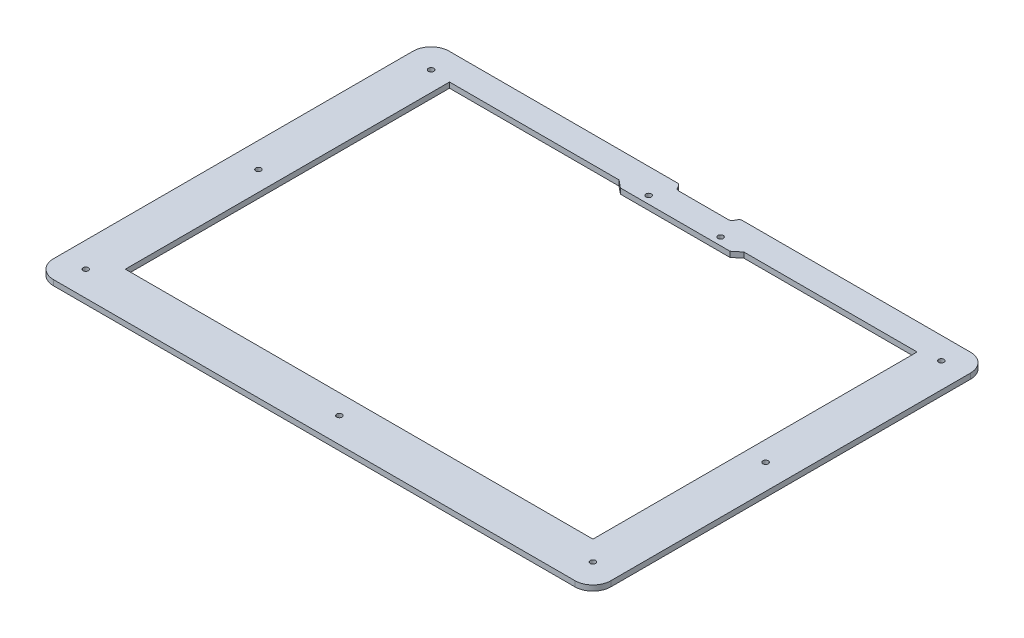
ISO-10303-21;
HEADER;
FILE_DESCRIPTION(('STEP AP214'),'2;1');
FILE_NAME('part.step','',(''),(''),'','','');
FILE_SCHEMA(('AUTOMOTIVE_DESIGN { 1 0 10303 214 1 1 1 1 }'));
ENDSEC;
DATA;
#1=APPLICATION_CONTEXT('core data for automotive mechanical design processes');
#2=APPLICATION_PROTOCOL_DEFINITION('international standard','automotive_design',2000,#1);
#3=PRODUCT_CONTEXT('',#1,'mechanical');
#4=PRODUCT('Part','Part','',(#3));
#5=PRODUCT_RELATED_PRODUCT_CATEGORY('part','',(#4));
#6=PRODUCT_DEFINITION_FORMATION('','',#4);
#7=PRODUCT_DEFINITION_CONTEXT('part definition',#1,'design');
#8=PRODUCT_DEFINITION('design','',#6,#7);
#9=PRODUCT_DEFINITION_SHAPE('','',#8);
#10=(LENGTH_UNIT() NAMED_UNIT(*) SI_UNIT(.MILLI.,.METRE.));
#11=(NAMED_UNIT(*) PLANE_ANGLE_UNIT() SI_UNIT($,.RADIAN.));
#12=(NAMED_UNIT(*) SI_UNIT($,.STERADIAN.) SOLID_ANGLE_UNIT());
#13=UNCERTAINTY_MEASURE_WITH_UNIT(LENGTH_MEASURE(1.E-05),#10,'distance_accuracy_value','');
#14=(GEOMETRIC_REPRESENTATION_CONTEXT(3) GLOBAL_UNCERTAINTY_ASSIGNED_CONTEXT((#13)) GLOBAL_UNIT_ASSIGNED_CONTEXT((#10,
#11,#12)) REPRESENTATION_CONTEXT('',''));
#15=CARTESIAN_POINT('',(0.,0.,0.));
#16=DIRECTION('',(0.,0.,1.));
#17=DIRECTION('',(1.,0.,0.));
#18=AXIS2_PLACEMENT_3D('',#15,#16,#17);
#19=CARTESIAN_POINT('',(10.,3.,10.));
#20=DIRECTION('',(0.,1.,0.));
#21=DIRECTION('',(0.,0.,1.));
#22=AXIS2_PLACEMENT_3D('',#19,#20,#21);
#23=PLANE('',#22);
#24=CARTESIAN_POINT('',(14.,3.,110.));
#25=DIRECTION('',(0.,1.,0.));
#26=DIRECTION('',(0.,0.,1.));
#27=AXIS2_PLACEMENT_3D('',#24,#25,#26);
#28=CIRCLE('',#27,1.49999999999997);
#29=CARTESIAN_POINT('',(14.,3.,111.5));
#30=VERTEX_POINT('',#29);
#31=EDGE_CURVE('E268',#30,#30,#28,.T.);
#32=ORIENTED_EDGE('',*,*,#31,.F.);
#33=EDGE_LOOP('',(#32));
#34=FACE_BOUND('',#33,.T.);
#35=CARTESIAN_POINT('',(155.,3.,206.));
#36=DIRECTION('',(0.,1.,0.));
#37=DIRECTION('',(0.,0.,1.));
#38=AXIS2_PLACEMENT_3D('',#35,#36,#37);
#39=CIRCLE('',#38,1.5);
#40=CARTESIAN_POINT('',(155.,3.,207.5));
#41=VERTEX_POINT('',#40);
#42=EDGE_CURVE('E280',#41,#41,#39,.T.);
#43=ORIENTED_EDGE('',*,*,#42,.F.);
#44=EDGE_LOOP('',(#43));
#45=FACE_BOUND('',#44,.T.);
#46=CARTESIAN_POINT('',(296.,3.,206.));
#47=DIRECTION('',(0.,1.,0.));
#48=DIRECTION('',(0.,0.,1.));
#49=AXIS2_PLACEMENT_3D('',#46,#47,#48);
#50=CIRCLE('',#49,1.49999999999996);
#51=CARTESIAN_POINT('',(296.,3.,207.5));
#52=VERTEX_POINT('',#51);
#53=EDGE_CURVE('E292',#52,#52,#50,.T.);
#54=ORIENTED_EDGE('',*,*,#53,.F.);
#55=EDGE_LOOP('',(#54));
#56=FACE_BOUND('',#55,.T.);
#57=CARTESIAN_POINT('',(14.,3.,14.));
#58=DIRECTION('',(0.,1.,0.));
#59=DIRECTION('',(0.,0.,1.));
#60=AXIS2_PLACEMENT_3D('',#57,#58,#59);
#61=CIRCLE('',#60,1.5);
#62=CARTESIAN_POINT('',(14.,3.,15.5));
#63=VERTEX_POINT('',#62);
#64=EDGE_CURVE('E304',#63,#63,#61,.T.);
#65=ORIENTED_EDGE('',*,*,#64,.F.);
#66=EDGE_LOOP('',(#65));
#67=FACE_BOUND('',#66,.T.);
#68=CARTESIAN_POINT('',(10.,3.,10.));
#69=DIRECTION('',(0.,1.,0.));
#70=DIRECTION('',(0.,0.,1.));
#71=AXIS2_PLACEMENT_3D('',#68,#69,#70);
#72=CIRCLE('',#71,10.);
#73=CARTESIAN_POINT('',(10.,3.,0.));
#74=VERTEX_POINT('',#73);
#75=CARTESIAN_POINT('',(0.,3.,10.));
#76=VERTEX_POINT('',#75);
#77=EDGE_CURVE('E316',#74,#76,#72,.T.);
#78=ORIENTED_EDGE('',*,*,#77,.T.);
#79=DIRECTION('',(0.,0.,1.));
#80=VECTOR('',#79,1.);
#81=CARTESIAN_POINT('',(0.,3.,10.));
#82=LINE('',#81,#80);
#83=CARTESIAN_POINT('',(0.,3.,210.));
#84=VERTEX_POINT('',#83);
#85=EDGE_CURVE('E319',#76,#84,#82,.T.);
#86=ORIENTED_EDGE('',*,*,#85,.T.);
#87=CARTESIAN_POINT('',(10.,3.,210.));
#88=DIRECTION('',(0.,1.,0.));
#89=DIRECTION('',(0.,0.,1.));
#90=AXIS2_PLACEMENT_3D('',#87,#88,#89);
#91=CIRCLE('',#90,10.);
#92=CARTESIAN_POINT('',(10.,3.,220.));
#93=VERTEX_POINT('',#92);
#94=EDGE_CURVE('E322',#84,#93,#91,.T.);
#95=ORIENTED_EDGE('',*,*,#94,.T.);
#96=DIRECTION('',(1.,0.,0.));
#97=VECTOR('',#96,1.);
#98=CARTESIAN_POINT('',(10.,3.,220.));
#99=LINE('',#98,#97);
#100=CARTESIAN_POINT('',(300.,3.,220.));
#101=VERTEX_POINT('',#100);
#102=EDGE_CURVE('E324',#93,#101,#99,.T.);
#103=ORIENTED_EDGE('',*,*,#102,.T.);
#104=CARTESIAN_POINT('',(300.,3.,210.));
#105=DIRECTION('',(0.,1.,0.));
#106=DIRECTION('',(0.,0.,1.));
#107=AXIS2_PLACEMENT_3D('',#104,#105,#106);
#108=CIRCLE('',#107,9.99999999999999);
#109=CARTESIAN_POINT('',(310.,3.,210.));
#110=VERTEX_POINT('',#109);
#111=EDGE_CURVE('E326',#101,#110,#108,.T.);
#112=ORIENTED_EDGE('',*,*,#111,.T.);
#113=DIRECTION('',(0.,0.,-1.));
#114=VECTOR('',#113,1.);
#115=CARTESIAN_POINT('',(310.,3.,10.));
#116=LINE('',#115,#114);
#117=CARTESIAN_POINT('',(310.,3.,10.));
#118=VERTEX_POINT('',#117);
#119=EDGE_CURVE('E328',#110,#118,#116,.T.);
#120=ORIENTED_EDGE('',*,*,#119,.T.);
#121=CARTESIAN_POINT('',(300.,3.,10.));
#122=DIRECTION('',(0.,1.,0.));
#123=DIRECTION('',(0.,0.,-1.));
#124=AXIS2_PLACEMENT_3D('',#121,#122,#123);
#125=CIRCLE('',#124,9.99999999999998);
#126=CARTESIAN_POINT('',(300.,3.,0.));
#127=VERTEX_POINT('',#126);
#128=EDGE_CURVE('E330',#118,#127,#125,.T.);
#129=ORIENTED_EDGE('',*,*,#128,.T.);
#130=DIRECTION('',(-1.,0.,0.));
#131=VECTOR('',#130,1.);
#132=CARTESIAN_POINT('',(173.115639288473,3.,0.));
#133=LINE('',#132,#131);
#134=CARTESIAN_POINT('',(173.115639288473,3.,0.));
#135=VERTEX_POINT('',#134);
#136=EDGE_CURVE('E332',#127,#135,#133,.T.);
#137=ORIENTED_EDGE('',*,*,#136,.T.);
#138=CARTESIAN_POINT('',(173.115639288473,3.,2.));
#139=DIRECTION('',(0.,1.,0.));
#140=DIRECTION('',(0.,0.,1.));
#141=AXIS2_PLACEMENT_3D('',#138,#139,#140);
#142=CIRCLE('',#141,2.00000000000001);
#143=CARTESIAN_POINT('',(171.365639288473,3.,1.03175416344815));
#144=VERTEX_POINT('',#143);
#145=EDGE_CURVE('E334',#135,#144,#142,.T.);
#146=ORIENTED_EDGE('',*,*,#145,.T.);
#147=DIRECTION('',(-0.484122918275928,0.,0.874999999999999));
#148=VECTOR('',#147,1.);
#149=CARTESIAN_POINT('',(170.570852384631,3.,2.46824583655185));
#150=LINE('',#149,#148);
#151=CARTESIAN_POINT('',(170.570852384631,3.,2.46824583655186));
#152=VERTEX_POINT('',#151);
#153=EDGE_CURVE('E336',#144,#152,#150,.T.);
#154=ORIENTED_EDGE('',*,*,#153,.T.);
#155=CARTESIAN_POINT('',(168.820852384631,3.,1.5));
#156=DIRECTION('',(0.,-1.,0.));
#157=DIRECTION('',(0.,0.,-1.));
#158=AXIS2_PLACEMENT_3D('',#155,#156,#157);
#159=CIRCLE('',#158,1.99999999999999);
#160=CARTESIAN_POINT('',(168.820852384631,3.,3.5));
#161=VERTEX_POINT('',#160);
#162=EDGE_CURVE('E338',#152,#161,#159,.T.);
#163=ORIENTED_EDGE('',*,*,#162,.T.);
#164=DIRECTION('',(-1.,0.,0.));
#165=VECTOR('',#164,1.);
#166=CARTESIAN_POINT('',(141.179147615369,3.,3.5));
#167=LINE('',#166,#165);
#168=CARTESIAN_POINT('',(141.179147615369,3.,3.50000000000002));
#169=VERTEX_POINT('',#168);
#170=EDGE_CURVE('E340',#161,#169,#167,.T.);
#171=ORIENTED_EDGE('',*,*,#170,.T.);
#172=CARTESIAN_POINT('',(141.179147615369,3.,1.5));
#173=DIRECTION('',(0.,-1.,0.));
#174=DIRECTION('',(0.,0.,-1.));
#175=AXIS2_PLACEMENT_3D('',#172,#173,#174);
#176=CIRCLE('',#175,2.00000000000002);
#177=CARTESIAN_POINT('',(139.429147615369,3.,2.46824583655182));
#178=VERTEX_POINT('',#177);
#179=EDGE_CURVE('E342',#169,#178,#176,.T.);
#180=ORIENTED_EDGE('',*,*,#179,.T.);
#181=DIRECTION('',(-0.484122918275918,0.,-0.875000000000005));
#182=VECTOR('',#181,1.);
#183=CARTESIAN_POINT('',(139.429147615369,3.,2.46824583655182));
#184=LINE('',#183,#182);
#185=CARTESIAN_POINT('',(138.634360711527,3.,1.03175416344817));
#186=VERTEX_POINT('',#185);
#187=EDGE_CURVE('E344',#178,#186,#184,.T.);
#188=ORIENTED_EDGE('',*,*,#187,.T.);
#189=CARTESIAN_POINT('',(136.884360711527,3.,2.));
#190=DIRECTION('',(0.,1.,0.));
#191=DIRECTION('',(0.,0.,-1.));
#192=AXIS2_PLACEMENT_3D('',#189,#190,#191);
#193=CIRCLE('',#192,1.99999999999999);
#194=CARTESIAN_POINT('',(136.884360711527,3.,0.));
#195=VERTEX_POINT('',#194);
#196=EDGE_CURVE('E346',#186,#195,#193,.T.);
#197=ORIENTED_EDGE('',*,*,#196,.T.);
#198=DIRECTION('',(-1.,0.,0.));
#199=VECTOR('',#198,1.);
#200=CARTESIAN_POINT('',(10.,3.,0.));
#201=LINE('',#200,#199);
#202=EDGE_CURVE('E348',#195,#74,#201,.T.);
#203=ORIENTED_EDGE('',*,*,#202,.T.);
#204=EDGE_LOOP('',(#78,#86,#95,#103,#112,#120,#129,#137,#146,#154,#163,#171,#180,#188,#197,#203));
#205=FACE_BOUND('',#204,.T.);
#206=CARTESIAN_POINT('',(296.,3.,110.));
#207=DIRECTION('',(0.,1.,0.));
#208=DIRECTION('',(0.,0.,1.));
#209=AXIS2_PLACEMENT_3D('',#206,#207,#208);
#210=CIRCLE('',#209,1.49999999999997);
#211=CARTESIAN_POINT('',(296.,3.,111.5));
#212=VERTEX_POINT('',#211);
#213=EDGE_CURVE('E310',#212,#212,#210,.T.);
#214=ORIENTED_EDGE('',*,*,#213,.F.);
#215=EDGE_LOOP('',(#214));
#216=FACE_BOUND('',#215,.T.);
#217=CARTESIAN_POINT('',(14.,3.,206.));
#218=DIRECTION('',(0.,1.,0.));
#219=DIRECTION('',(0.,0.,1.));
#220=AXIS2_PLACEMENT_3D('',#217,#218,#219);
#221=CIRCLE('',#220,1.5);
#222=CARTESIAN_POINT('',(14.,3.,207.5));
#223=VERTEX_POINT('',#222);
#224=EDGE_CURVE('E298',#223,#223,#221,.T.);
#225=ORIENTED_EDGE('',*,*,#224,.F.);
#226=EDGE_LOOP('',(#225));
#227=FACE_BOUND('',#226,.T.);
#228=CARTESIAN_POINT('',(296.,3.,12.2856825395512));
#229=DIRECTION('',(0.,1.,0.));
#230=DIRECTION('',(0.,0.,1.));
#231=AXIS2_PLACEMENT_3D('',#228,#229,#230);
#232=CIRCLE('',#231,1.49999999999997);
#233=CARTESIAN_POINT('',(296.,3.,13.7856825395512));
#234=VERTEX_POINT('',#233);
#235=EDGE_CURVE('E286',#234,#234,#232,.T.);
#236=ORIENTED_EDGE('',*,*,#235,.F.);
#237=EDGE_LOOP('',(#236));
#238=FACE_BOUND('',#237,.T.);
#239=CARTESIAN_POINT('',(175.,3.,14.));
#240=DIRECTION('',(0.,1.,0.));
#241=DIRECTION('',(0.,0.,1.));
#242=AXIS2_PLACEMENT_3D('',#239,#240,#241);
#243=CIRCLE('',#242,1.49999999999997);
#244=CARTESIAN_POINT('',(175.,3.,15.5));
#245=VERTEX_POINT('',#244);
#246=EDGE_CURVE('E274',#245,#245,#243,.T.);
#247=ORIENTED_EDGE('',*,*,#246,.F.);
#248=EDGE_LOOP('',(#247));
#249=FACE_BOUND('',#248,.T.);
#250=CARTESIAN_POINT('',(135.,3.,14.));
#251=DIRECTION('',(0.,1.,0.));
#252=DIRECTION('',(0.,0.,1.));
#253=AXIS2_PLACEMENT_3D('',#250,#251,#252);
#254=CIRCLE('',#253,1.49999999999997);
#255=CARTESIAN_POINT('',(135.,3.,15.5));
#256=VERTEX_POINT('',#255);
#257=EDGE_CURVE('E262',#256,#256,#254,.T.);
#258=ORIENTED_EDGE('',*,*,#257,.F.);
#259=EDGE_LOOP('',(#258));
#260=FACE_BOUND('',#259,.T.);
#261=DIRECTION('',(-1.,0.,0.));
#262=VECTOR('',#261,1.);
#263=CARTESIAN_POINT('',(119.25,3.,14.75));
#264=LINE('',#263,#262);
#265=CARTESIAN_POINT('',(119.25,3.,14.75));
#266=VERTEX_POINT('',#265);
#267=CARTESIAN_POINT('',(25.,3.,14.7500000000004));
#268=VERTEX_POINT('',#267);
#269=EDGE_CURVE('E205',#266,#268,#264,.T.);
#270=ORIENTED_EDGE('',*,*,#269,.F.);
#271=DIRECTION('',(-0.77518690013775,0.,-0.631731960450654));
#272=VECTOR('',#271,1.);
#273=CARTESIAN_POINT('',(123.544786903842,3.,18.25));
#274=LINE('',#273,#272);
#275=CARTESIAN_POINT('',(123.544786903842,3.,18.25));
#276=VERTEX_POINT('',#275);
#277=EDGE_CURVE('E197',#276,#266,#274,.T.);
#278=ORIENTED_EDGE('',*,*,#277,.F.);
#279=DIRECTION('',(-1.,0.,0.));
#280=VECTOR('',#279,1.);
#281=CARTESIAN_POINT('',(184.455213096158,3.,18.25));
#282=LINE('',#281,#280);
#283=CARTESIAN_POINT('',(184.455213096158,3.,18.25));
#284=VERTEX_POINT('',#283);
#285=EDGE_CURVE('E230',#284,#276,#282,.T.);
#286=ORIENTED_EDGE('',*,*,#285,.F.);
#287=DIRECTION('',(-0.775186900137753,0.,0.63173196045065));
#288=VECTOR('',#287,1.);
#289=CARTESIAN_POINT('',(184.455213096158,3.,18.25));
#290=LINE('',#289,#288);
#291=CARTESIAN_POINT('',(188.75,3.,14.75));
#292=VERTEX_POINT('',#291);
#293=EDGE_CURVE('E228',#292,#284,#290,.T.);
#294=ORIENTED_EDGE('',*,*,#293,.F.);
#295=DIRECTION('',(-1.,0.,0.));
#296=VECTOR('',#295,1.);
#297=CARTESIAN_POINT('',(188.75,3.,14.75));
#298=LINE('',#297,#296);
#299=CARTESIAN_POINT('',(285.,3.,14.75));
#300=VERTEX_POINT('',#299);
#301=EDGE_CURVE('E226',#300,#292,#298,.T.);
#302=ORIENTED_EDGE('',*,*,#301,.F.);
#303=DIRECTION('',(0.,0.,-1.));
#304=VECTOR('',#303,1.);
#305=CARTESIAN_POINT('',(285.,3.,195.));
#306=LINE('',#305,#304);
#307=CARTESIAN_POINT('',(285.,3.,195.));
#308=VERTEX_POINT('',#307);
#309=EDGE_CURVE('E224',#308,#300,#306,.T.);
#310=ORIENTED_EDGE('',*,*,#309,.F.);
#311=DIRECTION('',(1.,0.,0.));
#312=VECTOR('',#311,1.);
#313=CARTESIAN_POINT('',(25.,3.,195.));
#314=LINE('',#313,#312);
#315=CARTESIAN_POINT('',(25.,3.,195.));
#316=VERTEX_POINT('',#315);
#317=EDGE_CURVE('E220',#316,#308,#314,.T.);
#318=ORIENTED_EDGE('',*,*,#317,.F.);
#319=DIRECTION('',(0.,0.,1.));
#320=VECTOR('',#319,1.);
#321=CARTESIAN_POINT('',(25.,3.,14.7500000000004));
#322=LINE('',#321,#320);
#323=EDGE_CURVE('E218',#268,#316,#322,.T.);
#324=ORIENTED_EDGE('',*,*,#323,.F.);
#325=EDGE_LOOP('',(#270,#278,#286,#294,#302,#310,#318,#324));
#326=FACE_BOUND('',#325,.T.);
#327=ADVANCED_FACE('F36',(#34,#45,#56,#67,#205,#216,#227,#238,#249,#260,#326),#23,.T.);
#328=CARTESIAN_POINT('',(10.,0.,10.));
#329=DIRECTION('',(0.,1.,0.));
#330=DIRECTION('',(0.,0.,1.));
#331=AXIS2_PLACEMENT_3D('',#328,#329,#330);
#332=PLANE('',#331);
#333=CARTESIAN_POINT('',(135.,0.,14.));
#334=DIRECTION('',(0.,1.,0.));
#335=DIRECTION('',(0.,0.,1.));
#336=AXIS2_PLACEMENT_3D('',#333,#334,#335);
#337=CIRCLE('',#336,1.49999999999997);
#338=CARTESIAN_POINT('',(135.,0.,15.5));
#339=VERTEX_POINT('',#338);
#340=EDGE_CURVE('E213',#339,#339,#337,.T.);
#341=ORIENTED_EDGE('',*,*,#340,.T.);
#342=EDGE_LOOP('',(#341));
#343=FACE_BOUND('',#342,.T.);
#344=CARTESIAN_POINT('',(14.,0.,110.));
#345=DIRECTION('',(0.,1.,0.));
#346=DIRECTION('',(0.,0.,1.));
#347=AXIS2_PLACEMENT_3D('',#344,#345,#346);
#348=CIRCLE('',#347,1.49999999999997);
#349=CARTESIAN_POINT('',(14.,0.,111.5));
#350=VERTEX_POINT('',#349);
#351=EDGE_CURVE('E265',#350,#350,#348,.T.);
#352=ORIENTED_EDGE('',*,*,#351,.T.);
#353=EDGE_LOOP('',(#352));
#354=FACE_BOUND('',#353,.T.);
#355=CARTESIAN_POINT('',(175.,0.,14.));
#356=DIRECTION('',(0.,1.,0.));
#357=DIRECTION('',(0.,0.,1.));
#358=AXIS2_PLACEMENT_3D('',#355,#356,#357);
#359=CIRCLE('',#358,1.49999999999997);
#360=CARTESIAN_POINT('',(175.,0.,15.5));
#361=VERTEX_POINT('',#360);
#362=EDGE_CURVE('E271',#361,#361,#359,.T.);
#363=ORIENTED_EDGE('',*,*,#362,.T.);
#364=EDGE_LOOP('',(#363));
#365=FACE_BOUND('',#364,.T.);
#366=CARTESIAN_POINT('',(155.,0.,206.));
#367=DIRECTION('',(0.,1.,0.));
#368=DIRECTION('',(0.,0.,1.));
#369=AXIS2_PLACEMENT_3D('',#366,#367,#368);
#370=CIRCLE('',#369,1.5);
#371=CARTESIAN_POINT('',(155.,0.,207.5));
#372=VERTEX_POINT('',#371);
#373=EDGE_CURVE('E277',#372,#372,#370,.T.);
#374=ORIENTED_EDGE('',*,*,#373,.T.);
#375=EDGE_LOOP('',(#374));
#376=FACE_BOUND('',#375,.T.);
#377=CARTESIAN_POINT('',(296.,0.,12.2856825395512));
#378=DIRECTION('',(0.,1.,0.));
#379=DIRECTION('',(0.,0.,1.));
#380=AXIS2_PLACEMENT_3D('',#377,#378,#379);
#381=CIRCLE('',#380,1.49999999999997);
#382=CARTESIAN_POINT('',(296.,0.,13.7856825395512));
#383=VERTEX_POINT('',#382);
#384=EDGE_CURVE('E283',#383,#383,#381,.T.);
#385=ORIENTED_EDGE('',*,*,#384,.T.);
#386=EDGE_LOOP('',(#385));
#387=FACE_BOUND('',#386,.T.);
#388=CARTESIAN_POINT('',(296.,0.,206.));
#389=DIRECTION('',(0.,1.,0.));
#390=DIRECTION('',(0.,0.,1.));
#391=AXIS2_PLACEMENT_3D('',#388,#389,#390);
#392=CIRCLE('',#391,1.49999999999996);
#393=CARTESIAN_POINT('',(296.,0.,207.5));
#394=VERTEX_POINT('',#393);
#395=EDGE_CURVE('E289',#394,#394,#392,.T.);
#396=ORIENTED_EDGE('',*,*,#395,.T.);
#397=EDGE_LOOP('',(#396));
#398=FACE_BOUND('',#397,.T.);
#399=CARTESIAN_POINT('',(14.,0.,206.));
#400=DIRECTION('',(0.,1.,0.));
#401=DIRECTION('',(0.,0.,1.));
#402=AXIS2_PLACEMENT_3D('',#399,#400,#401);
#403=CIRCLE('',#402,1.5);
#404=CARTESIAN_POINT('',(14.,0.,207.5));
#405=VERTEX_POINT('',#404);
#406=EDGE_CURVE('E295',#405,#405,#403,.T.);
#407=ORIENTED_EDGE('',*,*,#406,.T.);
#408=EDGE_LOOP('',(#407));
#409=FACE_BOUND('',#408,.T.);
#410=CARTESIAN_POINT('',(14.,0.,14.));
#411=DIRECTION('',(0.,1.,0.));
#412=DIRECTION('',(0.,0.,1.));
#413=AXIS2_PLACEMENT_3D('',#410,#411,#412);
#414=CIRCLE('',#413,1.5);
#415=CARTESIAN_POINT('',(14.,0.,15.5));
#416=VERTEX_POINT('',#415);
#417=EDGE_CURVE('E301',#416,#416,#414,.T.);
#418=ORIENTED_EDGE('',*,*,#417,.T.);
#419=EDGE_LOOP('',(#418));
#420=FACE_BOUND('',#419,.T.);
#421=CARTESIAN_POINT('',(296.,0.,110.));
#422=DIRECTION('',(0.,1.,0.));
#423=DIRECTION('',(0.,0.,1.));
#424=AXIS2_PLACEMENT_3D('',#421,#422,#423);
#425=CIRCLE('',#424,1.49999999999997);
#426=CARTESIAN_POINT('',(296.,0.,111.5));
#427=VERTEX_POINT('',#426);
#428=EDGE_CURVE('E307',#427,#427,#425,.T.);
#429=ORIENTED_EDGE('',*,*,#428,.T.);
#430=EDGE_LOOP('',(#429));
#431=FACE_BOUND('',#430,.T.);
#432=CARTESIAN_POINT('',(10.,0.,10.));
#433=DIRECTION('',(0.,1.,0.));
#434=DIRECTION('',(0.,0.,1.));
#435=AXIS2_PLACEMENT_3D('',#432,#433,#434);
#436=CIRCLE('',#435,10.);
#437=CARTESIAN_POINT('',(10.,0.,0.));
#438=VERTEX_POINT('',#437);
#439=CARTESIAN_POINT('',(0.,0.,10.));
#440=VERTEX_POINT('',#439);
#441=EDGE_CURVE('E313',#438,#440,#436,.T.);
#442=ORIENTED_EDGE('',*,*,#441,.F.);
#443=DIRECTION('',(-1.,0.,0.));
#444=VECTOR('',#443,1.);
#445=CARTESIAN_POINT('',(10.,0.,0.));
#446=LINE('',#445,#444);
#447=CARTESIAN_POINT('',(136.884360711527,0.,0.));
#448=VERTEX_POINT('',#447);
#449=EDGE_CURVE('E320',#448,#438,#446,.T.);
#450=ORIENTED_EDGE('',*,*,#449,.F.);
#451=CARTESIAN_POINT('',(136.884360711527,0.,2.));
#452=DIRECTION('',(0.,1.,0.));
#453=DIRECTION('',(0.,0.,-1.));
#454=AXIS2_PLACEMENT_3D('',#451,#452,#453);
#455=CIRCLE('',#454,1.99999999999999);
#456=CARTESIAN_POINT('',(138.634360711527,0.,1.03175416344817));
#457=VERTEX_POINT('',#456);
#458=EDGE_CURVE('E379',#457,#448,#455,.T.);
#459=ORIENTED_EDGE('',*,*,#458,.F.);
#460=DIRECTION('',(-0.484122918275918,0.,-0.875000000000005));
#461=VECTOR('',#460,1.);
#462=CARTESIAN_POINT('',(139.429147615369,0.,2.46824583655182));
#463=LINE('',#462,#461);
#464=CARTESIAN_POINT('',(139.429147615369,0.,2.46824583655182));
#465=VERTEX_POINT('',#464);
#466=EDGE_CURVE('E377',#465,#457,#463,.T.);
#467=ORIENTED_EDGE('',*,*,#466,.F.);
#468=CARTESIAN_POINT('',(141.179147615369,0.,1.5));
#469=DIRECTION('',(0.,-1.,0.));
#470=DIRECTION('',(0.,0.,-1.));
#471=AXIS2_PLACEMENT_3D('',#468,#469,#470);
#472=CIRCLE('',#471,2.00000000000002);
#473=CARTESIAN_POINT('',(141.179147615369,0.,3.50000000000002));
#474=VERTEX_POINT('',#473);
#475=EDGE_CURVE('E375',#474,#465,#472,.T.);
#476=ORIENTED_EDGE('',*,*,#475,.F.);
#477=DIRECTION('',(-1.,0.,0.));
#478=VECTOR('',#477,1.);
#479=CARTESIAN_POINT('',(141.179147615369,0.,3.5));
#480=LINE('',#479,#478);
#481=CARTESIAN_POINT('',(168.820852384631,0.,3.5));
#482=VERTEX_POINT('',#481);
#483=EDGE_CURVE('E373',#482,#474,#480,.T.);
#484=ORIENTED_EDGE('',*,*,#483,.F.);
#485=CARTESIAN_POINT('',(168.820852384631,0.,1.5));
#486=DIRECTION('',(0.,-1.,0.));
#487=DIRECTION('',(0.,0.,-1.));
#488=AXIS2_PLACEMENT_3D('',#485,#486,#487);
#489=CIRCLE('',#488,1.99999999999999);
#490=CARTESIAN_POINT('',(170.570852384631,0.,2.46824583655186));
#491=VERTEX_POINT('',#490);
#492=EDGE_CURVE('E371',#491,#482,#489,.T.);
#493=ORIENTED_EDGE('',*,*,#492,.F.);
#494=DIRECTION('',(-0.484122918275928,0.,0.874999999999999));
#495=VECTOR('',#494,1.);
#496=CARTESIAN_POINT('',(170.570852384631,0.,2.46824583655185));
#497=LINE('',#496,#495);
#498=CARTESIAN_POINT('',(171.365639288473,0.,1.03175416344815));
#499=VERTEX_POINT('',#498);
#500=EDGE_CURVE('E369',#499,#491,#497,.T.);
#501=ORIENTED_EDGE('',*,*,#500,.F.);
#502=CARTESIAN_POINT('',(173.115639288473,0.,2.));
#503=DIRECTION('',(0.,1.,0.));
#504=DIRECTION('',(0.,0.,1.));
#505=AXIS2_PLACEMENT_3D('',#502,#503,#504);
#506=CIRCLE('',#505,2.00000000000001);
#507=CARTESIAN_POINT('',(173.115639288473,0.,0.));
#508=VERTEX_POINT('',#507);
#509=EDGE_CURVE('E367',#508,#499,#506,.T.);
#510=ORIENTED_EDGE('',*,*,#509,.F.);
#511=DIRECTION('',(-1.,0.,0.));
#512=VECTOR('',#511,1.);
#513=CARTESIAN_POINT('',(173.115639288473,0.,0.));
#514=LINE('',#513,#512);
#515=CARTESIAN_POINT('',(300.,0.,0.));
#516=VERTEX_POINT('',#515);
#517=EDGE_CURVE('E365',#516,#508,#514,.T.);
#518=ORIENTED_EDGE('',*,*,#517,.F.);
#519=CARTESIAN_POINT('',(300.,0.,10.));
#520=DIRECTION('',(0.,1.,0.));
#521=DIRECTION('',(0.,0.,-1.));
#522=AXIS2_PLACEMENT_3D('',#519,#520,#521);
#523=CIRCLE('',#522,9.99999999999998);
#524=CARTESIAN_POINT('',(310.,0.,10.));
#525=VERTEX_POINT('',#524);
#526=EDGE_CURVE('E363',#525,#516,#523,.T.);
#527=ORIENTED_EDGE('',*,*,#526,.F.);
#528=DIRECTION('',(0.,0.,-1.));
#529=VECTOR('',#528,1.);
#530=CARTESIAN_POINT('',(310.,0.,10.));
#531=LINE('',#530,#529);
#532=CARTESIAN_POINT('',(310.,0.,210.));
#533=VERTEX_POINT('',#532);
#534=EDGE_CURVE('E361',#533,#525,#531,.T.);
#535=ORIENTED_EDGE('',*,*,#534,.F.);
#536=CARTESIAN_POINT('',(300.,0.,210.));
#537=DIRECTION('',(0.,1.,0.));
#538=DIRECTION('',(0.,0.,1.));
#539=AXIS2_PLACEMENT_3D('',#536,#537,#538);
#540=CIRCLE('',#539,9.99999999999999);
#541=CARTESIAN_POINT('',(300.,0.,220.));
#542=VERTEX_POINT('',#541);
#543=EDGE_CURVE('E359',#542,#533,#540,.T.);
#544=ORIENTED_EDGE('',*,*,#543,.F.);
#545=DIRECTION('',(1.,0.,0.));
#546=VECTOR('',#545,1.);
#547=CARTESIAN_POINT('',(10.,0.,220.));
#548=LINE('',#547,#546);
#549=CARTESIAN_POINT('',(10.,0.,220.));
#550=VERTEX_POINT('',#549);
#551=EDGE_CURVE('E357',#550,#542,#548,.T.);
#552=ORIENTED_EDGE('',*,*,#551,.F.);
#553=CARTESIAN_POINT('',(10.,0.,210.));
#554=DIRECTION('',(0.,1.,0.));
#555=DIRECTION('',(0.,0.,1.));
#556=AXIS2_PLACEMENT_3D('',#553,#554,#555);
#557=CIRCLE('',#556,10.);
#558=CARTESIAN_POINT('',(0.,0.,210.));
#559=VERTEX_POINT('',#558);
#560=EDGE_CURVE('E355',#559,#550,#557,.T.);
#561=ORIENTED_EDGE('',*,*,#560,.F.);
#562=DIRECTION('',(0.,0.,1.));
#563=VECTOR('',#562,1.);
#564=CARTESIAN_POINT('',(0.,0.,10.));
#565=LINE('',#564,#563);
#566=EDGE_CURVE('E353',#440,#559,#565,.T.);
#567=ORIENTED_EDGE('',*,*,#566,.F.);
#568=EDGE_LOOP('',(#442,#450,#459,#467,#476,#484,#493,#501,#510,#518,#527,#535,#544,#552,#561,#567));
#569=FACE_BOUND('',#568,.T.);
#570=DIRECTION('',(-0.77518690013775,0.,-0.631731960450654));
#571=VECTOR('',#570,1.);
#572=CARTESIAN_POINT('',(123.544786903842,0.,18.25));
#573=LINE('',#572,#571);
#574=CARTESIAN_POINT('',(123.544786903842,0.,18.25));
#575=VERTEX_POINT('',#574);
#576=CARTESIAN_POINT('',(119.25,0.,14.75));
#577=VERTEX_POINT('',#576);
#578=EDGE_CURVE('E59',#575,#577,#573,.T.);
#579=ORIENTED_EDGE('',*,*,#578,.T.);
#580=DIRECTION('',(-1.,0.,0.));
#581=VECTOR('',#580,1.);
#582=CARTESIAN_POINT('',(119.25,0.,14.75));
#583=LINE('',#582,#581);
#584=CARTESIAN_POINT('',(25.,0.,14.7500000000004));
#585=VERTEX_POINT('',#584);
#586=EDGE_CURVE('E212',#577,#585,#583,.T.);
#587=ORIENTED_EDGE('',*,*,#586,.T.);
#588=DIRECTION('',(0.,0.,1.));
#589=VECTOR('',#588,1.);
#590=CARTESIAN_POINT('',(25.,0.,14.7500000000004));
#591=LINE('',#590,#589);
#592=CARTESIAN_POINT('',(25.,0.,195.));
#593=VERTEX_POINT('',#592);
#594=EDGE_CURVE('E234',#585,#593,#591,.T.);
#595=ORIENTED_EDGE('',*,*,#594,.T.);
#596=DIRECTION('',(1.,0.,0.));
#597=VECTOR('',#596,1.);
#598=CARTESIAN_POINT('',(25.,0.,195.));
#599=LINE('',#598,#597);
#600=CARTESIAN_POINT('',(285.,0.,195.));
#601=VERTEX_POINT('',#600);
#602=EDGE_CURVE('E237',#593,#601,#599,.T.);
#603=ORIENTED_EDGE('',*,*,#602,.T.);
#604=DIRECTION('',(0.,0.,-1.));
#605=VECTOR('',#604,1.);
#606=CARTESIAN_POINT('',(285.,0.,195.));
#607=LINE('',#606,#605);
#608=CARTESIAN_POINT('',(285.,0.,14.75));
#609=VERTEX_POINT('',#608);
#610=EDGE_CURVE('E240',#601,#609,#607,.T.);
#611=ORIENTED_EDGE('',*,*,#610,.T.);
#612=DIRECTION('',(-1.,0.,0.));
#613=VECTOR('',#612,1.);
#614=CARTESIAN_POINT('',(188.75,0.,14.75));
#615=LINE('',#614,#613);
#616=CARTESIAN_POINT('',(188.75,0.,14.75));
#617=VERTEX_POINT('',#616);
#618=EDGE_CURVE('E243',#609,#617,#615,.T.);
#619=ORIENTED_EDGE('',*,*,#618,.T.);
#620=DIRECTION('',(-0.775186900137753,0.,0.63173196045065));
#621=VECTOR('',#620,1.);
#622=CARTESIAN_POINT('',(184.455213096158,0.,18.25));
#623=LINE('',#622,#621);
#624=CARTESIAN_POINT('',(184.455213096158,0.,18.25));
#625=VERTEX_POINT('',#624);
#626=EDGE_CURVE('E246',#617,#625,#623,.T.);
#627=ORIENTED_EDGE('',*,*,#626,.T.);
#628=DIRECTION('',(-1.,0.,0.));
#629=VECTOR('',#628,1.);
#630=CARTESIAN_POINT('',(123.544786903842,0.,18.25));
#631=LINE('',#630,#629);
#632=EDGE_CURVE('E206',#625,#575,#631,.T.);
#633=ORIENTED_EDGE('',*,*,#632,.T.);
#634=EDGE_LOOP('',(#579,#587,#595,#603,#611,#619,#627,#633));
#635=FACE_BOUND('',#634,.T.);
#636=ADVANCED_FACE('F433',(#343,#354,#365,#376,#387,#398,#409,#420,#431,#569,#635),#332,.F.);
#637=CARTESIAN_POINT('',(10.,3.,10.));
#638=DIRECTION('',(0.,-1.,0.));
#639=DIRECTION('',(0.,0.,-1.));
#640=AXIS2_PLACEMENT_3D('',#637,#638,#639);
#641=CYLINDRICAL_SURFACE('',#640,10.);
#642=ORIENTED_EDGE('',*,*,#441,.T.);
#643=DIRECTION('',(0.,-1.,0.));
#644=VECTOR('',#643,1.);
#645=CARTESIAN_POINT('',(0.,3.,10.));
#646=LINE('',#645,#644);
#647=EDGE_CURVE('E11',#76,#440,#646,.T.);
#648=ORIENTED_EDGE('',*,*,#647,.F.);
#649=ORIENTED_EDGE('',*,*,#77,.F.);
#650=DIRECTION('',(0.,-1.,0.));
#651=VECTOR('',#650,1.);
#652=CARTESIAN_POINT('',(10.,3.,0.));
#653=LINE('',#652,#651);
#654=EDGE_CURVE('E350',#74,#438,#653,.T.);
#655=ORIENTED_EDGE('',*,*,#654,.T.);
#656=EDGE_LOOP('',(#642,#648,#649,#655));
#657=FACE_BOUND('',#656,.T.);
#658=ADVANCED_FACE('F38',(#657),#641,.T.);
#659=CARTESIAN_POINT('',(0.,3.,10.));
#660=DIRECTION('',(1.,0.,0.));
#661=DIRECTION('',(0.,0.,-1.));
#662=AXIS2_PLACEMENT_3D('',#659,#660,#661);
#663=PLANE('',#662);
#664=ORIENTED_EDGE('',*,*,#566,.T.);
#665=DIRECTION('',(0.,-1.,0.));
#666=VECTOR('',#665,1.);
#667=CARTESIAN_POINT('',(0.,3.,210.));
#668=LINE('',#667,#666);
#669=EDGE_CURVE('E44',#84,#559,#668,.T.);
#670=ORIENTED_EDGE('',*,*,#669,.F.);
#671=ORIENTED_EDGE('',*,*,#85,.F.);
#672=ORIENTED_EDGE('',*,*,#647,.T.);
#673=EDGE_LOOP('',(#664,#670,#671,#672));
#674=FACE_BOUND('',#673,.T.);
#675=ADVANCED_FACE('F451',(#674),#663,.F.);
#676=CARTESIAN_POINT('',(10.,3.,210.));
#677=DIRECTION('',(0.,-1.,0.));
#678=DIRECTION('',(0.,0.,-1.));
#679=AXIS2_PLACEMENT_3D('',#676,#677,#678);
#680=CYLINDRICAL_SURFACE('',#679,10.);
#681=ORIENTED_EDGE('',*,*,#560,.T.);
#682=DIRECTION('',(0.,-1.,0.));
#683=VECTOR('',#682,1.);
#684=CARTESIAN_POINT('',(10.,3.,220.));
#685=LINE('',#684,#683);
#686=EDGE_CURVE('E420',#93,#550,#685,.T.);
#687=ORIENTED_EDGE('',*,*,#686,.F.);
#688=ORIENTED_EDGE('',*,*,#94,.F.);
#689=ORIENTED_EDGE('',*,*,#669,.T.);
#690=EDGE_LOOP('',(#681,#687,#688,#689));
#691=FACE_BOUND('',#690,.T.);
#692=ADVANCED_FACE('F427',(#691),#680,.T.);
#693=CARTESIAN_POINT('',(10.,3.,220.));
#694=DIRECTION('',(0.,0.,-1.));
#695=DIRECTION('',(-1.,0.,0.));
#696=AXIS2_PLACEMENT_3D('',#693,#694,#695);
#697=PLANE('',#696);
#698=ORIENTED_EDGE('',*,*,#551,.T.);
#699=DIRECTION('',(0.,-1.,0.));
#700=VECTOR('',#699,1.);
#701=CARTESIAN_POINT('',(300.,3.,220.));
#702=LINE('',#701,#700);
#703=EDGE_CURVE('E417',#101,#542,#702,.T.);
#704=ORIENTED_EDGE('',*,*,#703,.F.);
#705=ORIENTED_EDGE('',*,*,#102,.F.);
#706=ORIENTED_EDGE('',*,*,#686,.T.);
#707=EDGE_LOOP('',(#698,#704,#705,#706));
#708=FACE_BOUND('',#707,.T.);
#709=ADVANCED_FACE('F439',(#708),#697,.F.);
#710=CARTESIAN_POINT('',(300.,3.,210.));
#711=DIRECTION('',(0.,-1.,0.));
#712=DIRECTION('',(0.,0.,-1.));
#713=AXIS2_PLACEMENT_3D('',#710,#711,#712);
#714=CYLINDRICAL_SURFACE('',#713,9.99999999999999);
#715=ORIENTED_EDGE('',*,*,#543,.T.);
#716=DIRECTION('',(0.,-1.,0.));
#717=VECTOR('',#716,1.);
#718=CARTESIAN_POINT('',(310.,3.,210.));
#719=LINE('',#718,#717);
#720=EDGE_CURVE('E414',#110,#533,#719,.T.);
#721=ORIENTED_EDGE('',*,*,#720,.F.);
#722=ORIENTED_EDGE('',*,*,#111,.F.);
#723=ORIENTED_EDGE('',*,*,#703,.T.);
#724=EDGE_LOOP('',(#715,#721,#722,#723));
#725=FACE_BOUND('',#724,.T.);
#726=ADVANCED_FACE('F443',(#725),#714,.T.);
#727=CARTESIAN_POINT('',(310.,3.,10.));
#728=DIRECTION('',(-1.,0.,0.));
#729=DIRECTION('',(0.,0.,1.));
#730=AXIS2_PLACEMENT_3D('',#727,#728,#729);
#731=PLANE('',#730);
#732=ORIENTED_EDGE('',*,*,#534,.T.);
#733=DIRECTION('',(0.,-1.,0.));
#734=VECTOR('',#733,1.);
#735=CARTESIAN_POINT('',(310.,3.,10.));
#736=LINE('',#735,#734);
#737=EDGE_CURVE('E411',#118,#525,#736,.T.);
#738=ORIENTED_EDGE('',*,*,#737,.F.);
#739=ORIENTED_EDGE('',*,*,#119,.F.);
#740=ORIENTED_EDGE('',*,*,#720,.T.);
#741=EDGE_LOOP('',(#732,#738,#739,#740));
#742=FACE_BOUND('',#741,.T.);
#743=ADVANCED_FACE('F504',(#742),#731,.F.);
#744=CARTESIAN_POINT('',(300.,3.,10.));
#745=DIRECTION('',(0.,-1.,0.));
#746=DIRECTION('',(0.,0.,-1.));
#747=AXIS2_PLACEMENT_3D('',#744,#745,#746);
#748=CYLINDRICAL_SURFACE('',#747,9.99999999999998);
#749=ORIENTED_EDGE('',*,*,#526,.T.);
#750=DIRECTION('',(0.,-1.,0.));
#751=VECTOR('',#750,1.);
#752=CARTESIAN_POINT('',(300.,3.,0.));
#753=LINE('',#752,#751);
#754=EDGE_CURVE('E408',#127,#516,#753,.T.);
#755=ORIENTED_EDGE('',*,*,#754,.F.);
#756=ORIENTED_EDGE('',*,*,#128,.F.);
#757=ORIENTED_EDGE('',*,*,#737,.T.);
#758=EDGE_LOOP('',(#749,#755,#756,#757));
#759=FACE_BOUND('',#758,.T.);
#760=ADVANCED_FACE('F501',(#759),#748,.T.);
#761=CARTESIAN_POINT('',(173.115639288473,3.,0.));
#762=DIRECTION('',(0.,0.,1.));
#763=DIRECTION('',(1.,0.,0.));
#764=AXIS2_PLACEMENT_3D('',#761,#762,#763);
#765=PLANE('',#764);
#766=ORIENTED_EDGE('',*,*,#517,.T.);
#767=DIRECTION('',(0.,-1.,0.));
#768=VECTOR('',#767,1.);
#769=CARTESIAN_POINT('',(173.115639288473,3.,0.));
#770=LINE('',#769,#768);
#771=EDGE_CURVE('E405',#135,#508,#770,.T.);
#772=ORIENTED_EDGE('',*,*,#771,.F.);
#773=ORIENTED_EDGE('',*,*,#136,.F.);
#774=ORIENTED_EDGE('',*,*,#754,.T.);
#775=EDGE_LOOP('',(#766,#772,#773,#774));
#776=FACE_BOUND('',#775,.T.);
#777=ADVANCED_FACE('F497',(#776),#765,.F.);
#778=CARTESIAN_POINT('',(173.115639288473,3.,2.));
#779=DIRECTION('',(0.,-1.,0.));
#780=DIRECTION('',(0.,0.,-1.));
#781=AXIS2_PLACEMENT_3D('',#778,#779,#780);
#782=CYLINDRICAL_SURFACE('',#781,2.00000000000001);
#783=ORIENTED_EDGE('',*,*,#509,.T.);
#784=DIRECTION('',(0.,-1.,0.));
#785=VECTOR('',#784,1.);
#786=CARTESIAN_POINT('',(171.365639288473,3.,1.03175416344815));
#787=LINE('',#786,#785);
#788=EDGE_CURVE('E402',#144,#499,#787,.T.);
#789=ORIENTED_EDGE('',*,*,#788,.F.);
#790=ORIENTED_EDGE('',*,*,#145,.F.);
#791=ORIENTED_EDGE('',*,*,#771,.T.);
#792=EDGE_LOOP('',(#783,#789,#790,#791));
#793=FACE_BOUND('',#792,.T.);
#794=ADVANCED_FACE('F493',(#793),#782,.T.);
#795=CARTESIAN_POINT('',(170.570852384631,3.,2.46824583655185));
#796=DIRECTION('',(0.874999999999999,0.,0.484122918275928));
#797=DIRECTION('',(0.484122918275928,0.,-0.874999999999999));
#798=AXIS2_PLACEMENT_3D('',#795,#796,#797);
#799=PLANE('',#798);
#800=ORIENTED_EDGE('',*,*,#500,.T.);
#801=DIRECTION('',(0.,-1.,0.));
#802=VECTOR('',#801,1.);
#803=CARTESIAN_POINT('',(170.570852384631,3.,2.46824583655186));
#804=LINE('',#803,#802);
#805=EDGE_CURVE('E399',#152,#491,#804,.T.);
#806=ORIENTED_EDGE('',*,*,#805,.F.);
#807=ORIENTED_EDGE('',*,*,#153,.F.);
#808=ORIENTED_EDGE('',*,*,#788,.T.);
#809=EDGE_LOOP('',(#800,#806,#807,#808));
#810=FACE_BOUND('',#809,.T.);
#811=ADVANCED_FACE('F488',(#810),#799,.F.);
#812=CARTESIAN_POINT('',(168.820852384631,3.,1.5));
#813=DIRECTION('',(0.,-1.,0.));
#814=DIRECTION('',(0.,0.,-1.));
#815=AXIS2_PLACEMENT_3D('',#812,#813,#814);
#816=CYLINDRICAL_SURFACE('',#815,1.99999999999999);
#817=ORIENTED_EDGE('',*,*,#492,.T.);
#818=DIRECTION('',(0.,-1.,0.));
#819=VECTOR('',#818,1.);
#820=CARTESIAN_POINT('',(168.820852384631,3.,3.5));
#821=LINE('',#820,#819);
#822=EDGE_CURVE('E396',#161,#482,#821,.T.);
#823=ORIENTED_EDGE('',*,*,#822,.F.);
#824=ORIENTED_EDGE('',*,*,#162,.F.);
#825=ORIENTED_EDGE('',*,*,#805,.T.);
#826=EDGE_LOOP('',(#817,#823,#824,#825));
#827=FACE_BOUND('',#826,.T.);
#828=ADVANCED_FACE('F482',(#827),#816,.F.);
#829=CARTESIAN_POINT('',(141.179147615369,3.,3.5));
#830=DIRECTION('',(0.,0.,1.));
#831=DIRECTION('',(1.,0.,0.));
#832=AXIS2_PLACEMENT_3D('',#829,#830,#831);
#833=PLANE('',#832);
#834=ORIENTED_EDGE('',*,*,#483,.T.);
#835=DIRECTION('',(0.,-1.,0.));
#836=VECTOR('',#835,1.);
#837=CARTESIAN_POINT('',(141.179147615369,3.,3.50000000000002));
#838=LINE('',#837,#836);
#839=EDGE_CURVE('E393',#169,#474,#838,.T.);
#840=ORIENTED_EDGE('',*,*,#839,.F.);
#841=ORIENTED_EDGE('',*,*,#170,.F.);
#842=ORIENTED_EDGE('',*,*,#822,.T.);
#843=EDGE_LOOP('',(#834,#840,#841,#842));
#844=FACE_BOUND('',#843,.T.);
#845=ADVANCED_FACE('F478',(#844),#833,.F.);
#846=CARTESIAN_POINT('',(141.179147615369,3.,1.5));
#847=DIRECTION('',(0.,-1.,0.));
#848=DIRECTION('',(0.,0.,-1.));
#849=AXIS2_PLACEMENT_3D('',#846,#847,#848);
#850=CYLINDRICAL_SURFACE('',#849,2.00000000000002);
#851=ORIENTED_EDGE('',*,*,#475,.T.);
#852=DIRECTION('',(0.,-1.,0.));
#853=VECTOR('',#852,1.);
#854=CARTESIAN_POINT('',(139.429147615369,3.,2.46824583655182));
#855=LINE('',#854,#853);
#856=EDGE_CURVE('E390',#178,#465,#855,.T.);
#857=ORIENTED_EDGE('',*,*,#856,.F.);
#858=ORIENTED_EDGE('',*,*,#179,.F.);
#859=ORIENTED_EDGE('',*,*,#839,.T.);
#860=EDGE_LOOP('',(#851,#857,#858,#859));
#861=FACE_BOUND('',#860,.T.);
#862=ADVANCED_FACE('F473',(#861),#850,.F.);
#863=CARTESIAN_POINT('',(139.429147615369,3.,2.46824583655182));
#864=DIRECTION('',(-0.875000000000005,0.,0.484122918275918));
#865=DIRECTION('',(0.484122918275918,0.,0.875000000000005));
#866=AXIS2_PLACEMENT_3D('',#863,#864,#865);
#867=PLANE('',#866);
#868=ORIENTED_EDGE('',*,*,#466,.T.);
#869=DIRECTION('',(0.,-1.,0.));
#870=VECTOR('',#869,1.);
#871=CARTESIAN_POINT('',(138.634360711527,3.,1.03175416344817));
#872=LINE('',#871,#870);
#873=EDGE_CURVE('E387',#186,#457,#872,.T.);
#874=ORIENTED_EDGE('',*,*,#873,.F.);
#875=ORIENTED_EDGE('',*,*,#187,.F.);
#876=ORIENTED_EDGE('',*,*,#856,.T.);
#877=EDGE_LOOP('',(#868,#874,#875,#876));
#878=FACE_BOUND('',#877,.T.);
#879=ADVANCED_FACE('F467',(#878),#867,.F.);
#880=CARTESIAN_POINT('',(136.884360711527,3.,2.));
#881=DIRECTION('',(0.,-1.,0.));
#882=DIRECTION('',(0.,0.,-1.));
#883=AXIS2_PLACEMENT_3D('',#880,#881,#882);
#884=CYLINDRICAL_SURFACE('',#883,1.99999999999999);
#885=ORIENTED_EDGE('',*,*,#458,.T.);
#886=DIRECTION('',(0.,-1.,0.));
#887=VECTOR('',#886,1.);
#888=CARTESIAN_POINT('',(136.884360711527,3.,0.));
#889=LINE('',#888,#887);
#890=EDGE_CURVE('E384',#195,#448,#889,.T.);
#891=ORIENTED_EDGE('',*,*,#890,.F.);
#892=ORIENTED_EDGE('',*,*,#196,.F.);
#893=ORIENTED_EDGE('',*,*,#873,.T.);
#894=EDGE_LOOP('',(#885,#891,#892,#893));
#895=FACE_BOUND('',#894,.T.);
#896=ADVANCED_FACE('F463',(#895),#884,.T.);
#897=CARTESIAN_POINT('',(10.,3.,0.));
#898=DIRECTION('',(0.,0.,1.));
#899=DIRECTION('',(1.,0.,0.));
#900=AXIS2_PLACEMENT_3D('',#897,#898,#899);
#901=PLANE('',#900);
#902=ORIENTED_EDGE('',*,*,#449,.T.);
#903=ORIENTED_EDGE('',*,*,#654,.F.);
#904=ORIENTED_EDGE('',*,*,#202,.F.);
#905=ORIENTED_EDGE('',*,*,#890,.T.);
#906=EDGE_LOOP('',(#902,#903,#904,#905));
#907=FACE_BOUND('',#906,.T.);
#908=ADVANCED_FACE('F458',(#907),#901,.F.);
#909=CARTESIAN_POINT('',(296.,3.,110.));
#910=DIRECTION('',(0.,-1.,0.));
#911=DIRECTION('',(0.,0.,-1.));
#912=AXIS2_PLACEMENT_3D('',#909,#910,#911);
#913=CYLINDRICAL_SURFACE('',#912,1.49999999999997);
#914=ORIENTED_EDGE('',*,*,#213,.T.);
#915=EDGE_LOOP('',(#914));
#916=FACE_BOUND('',#915,.T.);
#917=ORIENTED_EDGE('',*,*,#428,.F.);
#918=EDGE_LOOP('',(#917));
#919=FACE_BOUND('',#918,.T.);
#920=ADVANCED_FACE('F524',(#916,#919),#913,.F.);
#921=CARTESIAN_POINT('',(14.,3.,14.));
#922=DIRECTION('',(0.,-1.,0.));
#923=DIRECTION('',(0.,0.,-1.));
#924=AXIS2_PLACEMENT_3D('',#921,#922,#923);
#925=CYLINDRICAL_SURFACE('',#924,1.5);
#926=ORIENTED_EDGE('',*,*,#64,.T.);
#927=EDGE_LOOP('',(#926));
#928=FACE_BOUND('',#927,.T.);
#929=ORIENTED_EDGE('',*,*,#417,.F.);
#930=EDGE_LOOP('',(#929));
#931=FACE_BOUND('',#930,.T.);
#932=ADVANCED_FACE('F586',(#928,#931),#925,.F.);
#933=CARTESIAN_POINT('',(14.,3.,206.));
#934=DIRECTION('',(0.,-1.,0.));
#935=DIRECTION('',(0.,0.,-1.));
#936=AXIS2_PLACEMENT_3D('',#933,#934,#935);
#937=CYLINDRICAL_SURFACE('',#936,1.5);
#938=ORIENTED_EDGE('',*,*,#224,.T.);
#939=EDGE_LOOP('',(#938));
#940=FACE_BOUND('',#939,.T.);
#941=ORIENTED_EDGE('',*,*,#406,.F.);
#942=EDGE_LOOP('',(#941));
#943=FACE_BOUND('',#942,.T.);
#944=ADVANCED_FACE('F593',(#940,#943),#937,.F.);
#945=CARTESIAN_POINT('',(296.,3.,206.));
#946=DIRECTION('',(0.,-1.,0.));
#947=DIRECTION('',(0.,0.,-1.));
#948=AXIS2_PLACEMENT_3D('',#945,#946,#947);
#949=CYLINDRICAL_SURFACE('',#948,1.49999999999996);
#950=ORIENTED_EDGE('',*,*,#53,.T.);
#951=EDGE_LOOP('',(#950));
#952=FACE_BOUND('',#951,.T.);
#953=ORIENTED_EDGE('',*,*,#395,.F.);
#954=EDGE_LOOP('',(#953));
#955=FACE_BOUND('',#954,.T.);
#956=ADVANCED_FACE('F600',(#952,#955),#949,.F.);
#957=CARTESIAN_POINT('',(296.,3.,12.2856825395512));
#958=DIRECTION('',(0.,-1.,0.));
#959=DIRECTION('',(0.,0.,-1.));
#960=AXIS2_PLACEMENT_3D('',#957,#958,#959);
#961=CYLINDRICAL_SURFACE('',#960,1.49999999999997);
#962=ORIENTED_EDGE('',*,*,#235,.T.);
#963=EDGE_LOOP('',(#962));
#964=FACE_BOUND('',#963,.T.);
#965=ORIENTED_EDGE('',*,*,#384,.F.);
#966=EDGE_LOOP('',(#965));
#967=FACE_BOUND('',#966,.T.);
#968=ADVANCED_FACE('F608',(#964,#967),#961,.F.);
#969=CARTESIAN_POINT('',(155.,3.,206.));
#970=DIRECTION('',(0.,-1.,0.));
#971=DIRECTION('',(0.,0.,-1.));
#972=AXIS2_PLACEMENT_3D('',#969,#970,#971);
#973=CYLINDRICAL_SURFACE('',#972,1.5);
#974=ORIENTED_EDGE('',*,*,#42,.T.);
#975=EDGE_LOOP('',(#974));
#976=FACE_BOUND('',#975,.T.);
#977=ORIENTED_EDGE('',*,*,#373,.F.);
#978=EDGE_LOOP('',(#977));
#979=FACE_BOUND('',#978,.T.);
#980=ADVANCED_FACE('F616',(#976,#979),#973,.F.);
#981=CARTESIAN_POINT('',(175.,3.,14.));
#982=DIRECTION('',(0.,-1.,0.));
#983=DIRECTION('',(0.,0.,-1.));
#984=AXIS2_PLACEMENT_3D('',#981,#982,#983);
#985=CYLINDRICAL_SURFACE('',#984,1.49999999999997);
#986=ORIENTED_EDGE('',*,*,#246,.T.);
#987=EDGE_LOOP('',(#986));
#988=FACE_BOUND('',#987,.T.);
#989=ORIENTED_EDGE('',*,*,#362,.F.);
#990=EDGE_LOOP('',(#989));
#991=FACE_BOUND('',#990,.T.);
#992=ADVANCED_FACE('F624',(#988,#991),#985,.F.);
#993=CARTESIAN_POINT('',(14.,3.,110.));
#994=DIRECTION('',(0.,-1.,0.));
#995=DIRECTION('',(0.,0.,-1.));
#996=AXIS2_PLACEMENT_3D('',#993,#994,#995);
#997=CYLINDRICAL_SURFACE('',#996,1.49999999999997);
#998=ORIENTED_EDGE('',*,*,#31,.T.);
#999=EDGE_LOOP('',(#998));
#1000=FACE_BOUND('',#999,.T.);
#1001=ORIENTED_EDGE('',*,*,#351,.F.);
#1002=EDGE_LOOP('',(#1001));
#1003=FACE_BOUND('',#1002,.T.);
#1004=ADVANCED_FACE('F632',(#1000,#1003),#997,.F.);
#1005=CARTESIAN_POINT('',(135.,3.,14.));
#1006=DIRECTION('',(0.,-1.,0.));
#1007=DIRECTION('',(0.,0.,-1.));
#1008=AXIS2_PLACEMENT_3D('',#1005,#1006,#1007);
#1009=CYLINDRICAL_SURFACE('',#1008,1.49999999999997);
#1010=ORIENTED_EDGE('',*,*,#257,.T.);
#1011=EDGE_LOOP('',(#1010));
#1012=FACE_BOUND('',#1011,.T.);
#1013=ORIENTED_EDGE('',*,*,#340,.F.);
#1014=EDGE_LOOP('',(#1013));
#1015=FACE_BOUND('',#1014,.T.);
#1016=ADVANCED_FACE('F640',(#1012,#1015),#1009,.F.);
#1017=CARTESIAN_POINT('',(123.544786903842,3.,18.25));
#1018=DIRECTION('',(-0.631731960450654,0.,0.77518690013775));
#1019=DIRECTION('',(0.77518690013775,0.,0.631731960450654));
#1020=AXIS2_PLACEMENT_3D('',#1017,#1018,#1019);
#1021=PLANE('',#1020);
#1022=ORIENTED_EDGE('',*,*,#578,.F.);
#1023=DIRECTION('',(0.,-1.,0.));
#1024=VECTOR('',#1023,1.);
#1025=CARTESIAN_POINT('',(123.544786903842,3.,18.25));
#1026=LINE('',#1025,#1024);
#1027=EDGE_CURVE('E201',#276,#575,#1026,.T.);
#1028=ORIENTED_EDGE('',*,*,#1027,.F.);
#1029=ORIENTED_EDGE('',*,*,#277,.T.);
#1030=DIRECTION('',(0.,-1.,0.));
#1031=VECTOR('',#1030,1.);
#1032=CARTESIAN_POINT('',(119.25,3.,14.75));
#1033=LINE('',#1032,#1031);
#1034=EDGE_CURVE('E200',#266,#577,#1033,.T.);
#1035=ORIENTED_EDGE('',*,*,#1034,.T.);
#1036=EDGE_LOOP('',(#1022,#1028,#1029,#1035));
#1037=FACE_BOUND('',#1036,.T.);
#1038=ADVANCED_FACE('F199',(#1037),#1021,.T.);
#1039=CARTESIAN_POINT('',(119.25,3.,14.75));
#1040=DIRECTION('',(0.,0.,1.));
#1041=DIRECTION('',(1.,0.,0.));
#1042=AXIS2_PLACEMENT_3D('',#1039,#1040,#1041);
#1043=PLANE('',#1042);
#1044=ORIENTED_EDGE('',*,*,#586,.F.);
#1045=ORIENTED_EDGE('',*,*,#1034,.F.);
#1046=ORIENTED_EDGE('',*,*,#269,.T.);
#1047=DIRECTION('',(0.,-1.,0.));
#1048=VECTOR('',#1047,1.);
#1049=CARTESIAN_POINT('',(25.,3.,14.7500000000004));
#1050=LINE('',#1049,#1048);
#1051=EDGE_CURVE('E214',#268,#585,#1050,.T.);
#1052=ORIENTED_EDGE('',*,*,#1051,.T.);
#1053=EDGE_LOOP('',(#1044,#1045,#1046,#1052));
#1054=FACE_BOUND('',#1053,.T.);
#1055=ADVANCED_FACE('F209',(#1054),#1043,.T.);
#1056=CARTESIAN_POINT('',(25.,3.,14.7500000000004));
#1057=DIRECTION('',(1.,0.,0.));
#1058=DIRECTION('',(0.,0.,-1.));
#1059=AXIS2_PLACEMENT_3D('',#1056,#1057,#1058);
#1060=PLANE('',#1059);
#1061=ORIENTED_EDGE('',*,*,#594,.F.);
#1062=ORIENTED_EDGE('',*,*,#1051,.F.);
#1063=ORIENTED_EDGE('',*,*,#323,.T.);
#1064=DIRECTION('',(0.,-1.,0.));
#1065=VECTOR('',#1064,1.);
#1066=CARTESIAN_POINT('',(25.,3.,195.));
#1067=LINE('',#1066,#1065);
#1068=EDGE_CURVE('E259',#316,#593,#1067,.T.);
#1069=ORIENTED_EDGE('',*,*,#1068,.T.);
#1070=EDGE_LOOP('',(#1061,#1062,#1063,#1069));
#1071=FACE_BOUND('',#1070,.T.);
#1072=ADVANCED_FACE('F661',(#1071),#1060,.T.);
#1073=CARTESIAN_POINT('',(25.,3.,195.));
#1074=DIRECTION('',(0.,0.,-1.));
#1075=DIRECTION('',(-1.,0.,0.));
#1076=AXIS2_PLACEMENT_3D('',#1073,#1074,#1075);
#1077=PLANE('',#1076);
#1078=ORIENTED_EDGE('',*,*,#602,.F.);
#1079=ORIENTED_EDGE('',*,*,#1068,.F.);
#1080=ORIENTED_EDGE('',*,*,#317,.T.);
#1081=DIRECTION('',(0.,-1.,0.));
#1082=VECTOR('',#1081,1.);
#1083=CARTESIAN_POINT('',(285.,3.,195.));
#1084=LINE('',#1083,#1082);
#1085=EDGE_CURVE('E257',#308,#601,#1084,.T.);
#1086=ORIENTED_EDGE('',*,*,#1085,.T.);
#1087=EDGE_LOOP('',(#1078,#1079,#1080,#1086));
#1088=FACE_BOUND('',#1087,.T.);
#1089=ADVANCED_FACE('F668',(#1088),#1077,.T.);
#1090=CARTESIAN_POINT('',(285.,3.,195.));
#1091=DIRECTION('',(-1.,0.,0.));
#1092=DIRECTION('',(0.,0.,1.));
#1093=AXIS2_PLACEMENT_3D('',#1090,#1091,#1092);
#1094=PLANE('',#1093);
#1095=ORIENTED_EDGE('',*,*,#610,.F.);
#1096=ORIENTED_EDGE('',*,*,#1085,.F.);
#1097=ORIENTED_EDGE('',*,*,#309,.T.);
#1098=DIRECTION('',(0.,-1.,0.));
#1099=VECTOR('',#1098,1.);
#1100=CARTESIAN_POINT('',(285.,3.,14.75));
#1101=LINE('',#1100,#1099);
#1102=EDGE_CURVE('E255',#300,#609,#1101,.T.);
#1103=ORIENTED_EDGE('',*,*,#1102,.T.);
#1104=EDGE_LOOP('',(#1095,#1096,#1097,#1103));
#1105=FACE_BOUND('',#1104,.T.);
#1106=ADVANCED_FACE('F676',(#1105),#1094,.T.);
#1107=CARTESIAN_POINT('',(188.75,3.,14.75));
#1108=DIRECTION('',(0.,0.,1.));
#1109=DIRECTION('',(1.,0.,0.));
#1110=AXIS2_PLACEMENT_3D('',#1107,#1108,#1109);
#1111=PLANE('',#1110);
#1112=ORIENTED_EDGE('',*,*,#618,.F.);
#1113=ORIENTED_EDGE('',*,*,#1102,.F.);
#1114=ORIENTED_EDGE('',*,*,#301,.T.);
#1115=DIRECTION('',(0.,-1.,0.));
#1116=VECTOR('',#1115,1.);
#1117=CARTESIAN_POINT('',(188.75,3.,14.75));
#1118=LINE('',#1117,#1116);
#1119=EDGE_CURVE('E253',#292,#617,#1118,.T.);
#1120=ORIENTED_EDGE('',*,*,#1119,.T.);
#1121=EDGE_LOOP('',(#1112,#1113,#1114,#1120));
#1122=FACE_BOUND('',#1121,.T.);
#1123=ADVANCED_FACE('F684',(#1122),#1111,.T.);
#1124=CARTESIAN_POINT('',(184.455213096158,3.,18.25));
#1125=DIRECTION('',(0.63173196045065,0.,0.775186900137753));
#1126=DIRECTION('',(0.775186900137753,0.,-0.63173196045065));
#1127=AXIS2_PLACEMENT_3D('',#1124,#1125,#1126);
#1128=PLANE('',#1127);
#1129=ORIENTED_EDGE('',*,*,#626,.F.);
#1130=ORIENTED_EDGE('',*,*,#1119,.F.);
#1131=ORIENTED_EDGE('',*,*,#293,.T.);
#1132=DIRECTION('',(0.,-1.,0.));
#1133=VECTOR('',#1132,1.);
#1134=CARTESIAN_POINT('',(184.455213096158,3.,18.25));
#1135=LINE('',#1134,#1133);
#1136=EDGE_CURVE('E51',#284,#625,#1135,.T.);
#1137=ORIENTED_EDGE('',*,*,#1136,.T.);
#1138=EDGE_LOOP('',(#1129,#1130,#1131,#1137));
#1139=FACE_BOUND('',#1138,.T.);
#1140=ADVANCED_FACE('F692',(#1139),#1128,.T.);
#1141=CARTESIAN_POINT('',(123.544786903842,3.,18.25));
#1142=DIRECTION('',(0.,0.,1.));
#1143=DIRECTION('',(1.,0.,0.));
#1144=AXIS2_PLACEMENT_3D('',#1141,#1142,#1143);
#1145=PLANE('',#1144);
#1146=ORIENTED_EDGE('',*,*,#632,.F.);
#1147=ORIENTED_EDGE('',*,*,#1136,.F.);
#1148=ORIENTED_EDGE('',*,*,#285,.T.);
#1149=ORIENTED_EDGE('',*,*,#1027,.T.);
#1150=EDGE_LOOP('',(#1146,#1147,#1148,#1149));
#1151=FACE_BOUND('',#1150,.T.);
#1152=ADVANCED_FACE('F700',(#1151),#1145,.T.);
#1153=CLOSED_SHELL('',(#327,#636,#658,#675,#692,#709,#726,#743,#760,#777,#794,#811,#828,#845,
#862,#879,#896,#908,#920,#932,#944,#956,#968,#980,#992,#1004,#1016,#1038,#1055,#1072,#1089,
#1106,#1123,#1140,#1152));
#1154=MANIFOLD_SOLID_BREP('B2',#1153);
#1155=ADVANCED_BREP_SHAPE_REPRESENTATION('',(#18,#1154),#14);
#1156=SHAPE_DEFINITION_REPRESENTATION(#9,#1155);
ENDSEC;
END-ISO-10303-21;
